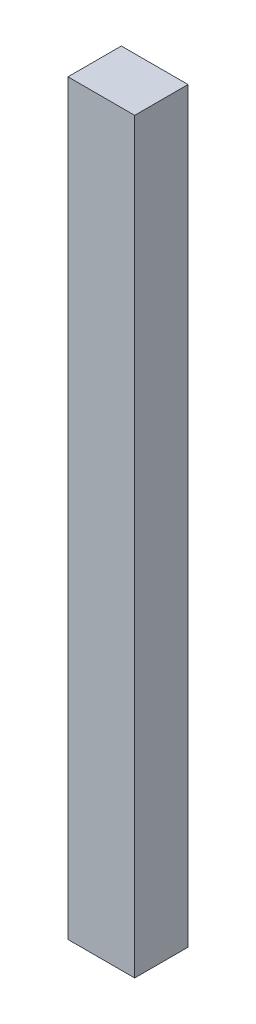
ISO-10303-21;
HEADER;
FILE_DESCRIPTION(('STEP AP214'),'2;1');
FILE_NAME('part.step','',(''),(''),'','','');
FILE_SCHEMA(('AUTOMOTIVE_DESIGN { 1 0 10303 214 1 1 1 1 }'));
ENDSEC;
DATA;
#1=APPLICATION_CONTEXT('core data for automotive mechanical design processes');
#2=APPLICATION_PROTOCOL_DEFINITION('international standard','automotive_design',2000,#1);
#3=PRODUCT_CONTEXT('',#1,'mechanical');
#4=PRODUCT('Part','Part','',(#3));
#5=PRODUCT_RELATED_PRODUCT_CATEGORY('part','',(#4));
#6=PRODUCT_DEFINITION_FORMATION('','',#4);
#7=PRODUCT_DEFINITION_CONTEXT('part definition',#1,'design');
#8=PRODUCT_DEFINITION('design','',#6,#7);
#9=PRODUCT_DEFINITION_SHAPE('','',#8);
#10=(LENGTH_UNIT() NAMED_UNIT(*) SI_UNIT(.MILLI.,.METRE.));
#11=(NAMED_UNIT(*) PLANE_ANGLE_UNIT() SI_UNIT($,.RADIAN.));
#12=(NAMED_UNIT(*) SI_UNIT($,.STERADIAN.) SOLID_ANGLE_UNIT());
#13=UNCERTAINTY_MEASURE_WITH_UNIT(LENGTH_MEASURE(1.E-05),#10,'distance_accuracy_value','');
#14=(GEOMETRIC_REPRESENTATION_CONTEXT(3) GLOBAL_UNCERTAINTY_ASSIGNED_CONTEXT((#13)) GLOBAL_UNIT_ASSIGNED_CONTEXT((#10,
#11,#12)) REPRESENTATION_CONTEXT('',''));
#15=CARTESIAN_POINT('',(0.,0.,0.));
#16=DIRECTION('',(0.,0.,1.));
#17=DIRECTION('',(1.,0.,0.));
#18=AXIS2_PLACEMENT_3D('',#15,#16,#17);
#19=CARTESIAN_POINT('',(25.,280.,40.));
#20=DIRECTION('',(0.,0.,-1.));
#21=DIRECTION('',(-1.,0.,0.));
#22=AXIS2_PLACEMENT_3D('',#19,#20,#21);
#23=PLANE('',#22);
#24=DIRECTION('',(1.,0.,0.));
#25=VECTOR('',#24,1.);
#26=CARTESIAN_POINT('',(25.,0.,40.));
#27=LINE('',#26,#25);
#28=CARTESIAN_POINT('',(0.,0.,40.));
#29=VERTEX_POINT('',#28);
#30=CARTESIAN_POINT('',(25.,0.,40.));
#31=VERTEX_POINT('',#30);
#32=EDGE_CURVE('E102',#29,#31,#27,.T.);
#33=ORIENTED_EDGE('',*,*,#32,.T.);
#34=DIRECTION('',(0.,-1.,0.));
#35=VECTOR('',#34,1.);
#36=CARTESIAN_POINT('',(25.,280.,40.));
#37=LINE('',#36,#35);
#38=CARTESIAN_POINT('',(25.,280.,40.));
#39=VERTEX_POINT('',#38);
#40=EDGE_CURVE('E11',#39,#31,#37,.T.);
#41=ORIENTED_EDGE('',*,*,#40,.F.);
#42=DIRECTION('',(1.,0.,0.));
#43=VECTOR('',#42,1.);
#44=CARTESIAN_POINT('',(25.,280.,40.));
#45=LINE('',#44,#43);
#46=CARTESIAN_POINT('',(0.,280.,40.));
#47=VERTEX_POINT('',#46);
#48=EDGE_CURVE('E90',#47,#39,#45,.T.);
#49=ORIENTED_EDGE('',*,*,#48,.F.);
#50=DIRECTION('',(0.,-1.,0.));
#51=VECTOR('',#50,1.);
#52=CARTESIAN_POINT('',(0.,280.,40.));
#53=LINE('',#52,#51);
#54=EDGE_CURVE('E98',#47,#29,#53,.T.);
#55=ORIENTED_EDGE('',*,*,#54,.T.);
#56=EDGE_LOOP('',(#33,#41,#49,#55));
#57=FACE_BOUND('',#56,.T.);
#58=ADVANCED_FACE('F39',(#57),#23,.F.);
#59=CARTESIAN_POINT('',(25.,280.,20.));
#60=DIRECTION('',(-1.,0.,0.));
#61=DIRECTION('',(0.,0.,1.));
#62=AXIS2_PLACEMENT_3D('',#59,#60,#61);
#63=PLANE('',#62);
#64=DIRECTION('',(0.,0.,-1.));
#65=VECTOR('',#64,1.);
#66=CARTESIAN_POINT('',(25.,0.,20.));
#67=LINE('',#66,#65);
#68=CARTESIAN_POINT('',(25.,0.,20.));
#69=VERTEX_POINT('',#68);
#70=EDGE_CURVE('E94',#31,#69,#67,.T.);
#71=ORIENTED_EDGE('',*,*,#70,.T.);
#72=DIRECTION('',(0.,-1.,0.));
#73=VECTOR('',#72,1.);
#74=CARTESIAN_POINT('',(25.,280.,20.));
#75=LINE('',#74,#73);
#76=CARTESIAN_POINT('',(25.,280.,20.));
#77=VERTEX_POINT('',#76);
#78=EDGE_CURVE('E47',#77,#69,#75,.T.);
#79=ORIENTED_EDGE('',*,*,#78,.F.);
#80=DIRECTION('',(0.,0.,-1.));
#81=VECTOR('',#80,1.);
#82=CARTESIAN_POINT('',(25.,280.,20.));
#83=LINE('',#82,#81);
#84=EDGE_CURVE('E85',#39,#77,#83,.T.);
#85=ORIENTED_EDGE('',*,*,#84,.F.);
#86=ORIENTED_EDGE('',*,*,#40,.T.);
#87=EDGE_LOOP('',(#71,#79,#85,#86));
#88=FACE_BOUND('',#87,.T.);
#89=ADVANCED_FACE('F93',(#88),#63,.F.);
#90=CARTESIAN_POINT('',(0.,280.,20.));
#91=DIRECTION('',(0.,0.,1.));
#92=DIRECTION('',(1.,0.,0.));
#93=AXIS2_PLACEMENT_3D('',#90,#91,#92);
#94=PLANE('',#93);
#95=DIRECTION('',(-1.,0.,0.));
#96=VECTOR('',#95,1.);
#97=CARTESIAN_POINT('',(0.,0.,20.));
#98=LINE('',#97,#96);
#99=CARTESIAN_POINT('',(0.,0.,20.));
#100=VERTEX_POINT('',#99);
#101=EDGE_CURVE('E72',#69,#100,#98,.T.);
#102=ORIENTED_EDGE('',*,*,#101,.T.);
#103=DIRECTION('',(0.,-1.,0.));
#104=VECTOR('',#103,1.);
#105=CARTESIAN_POINT('',(0.,280.,20.));
#106=LINE('',#105,#104);
#107=CARTESIAN_POINT('',(0.,280.,20.));
#108=VERTEX_POINT('',#107);
#109=EDGE_CURVE('E95',#108,#100,#106,.T.);
#110=ORIENTED_EDGE('',*,*,#109,.F.);
#111=DIRECTION('',(-1.,0.,0.));
#112=VECTOR('',#111,1.);
#113=CARTESIAN_POINT('',(0.,280.,20.));
#114=LINE('',#113,#112);
#115=EDGE_CURVE('E88',#77,#108,#114,.T.);
#116=ORIENTED_EDGE('',*,*,#115,.F.);
#117=ORIENTED_EDGE('',*,*,#78,.T.);
#118=EDGE_LOOP('',(#102,#110,#116,#117));
#119=FACE_BOUND('',#118,.T.);
#120=ADVANCED_FACE('F96',(#119),#94,.F.);
#121=CARTESIAN_POINT('',(0.,280.,40.));
#122=DIRECTION('',(1.,0.,0.));
#123=DIRECTION('',(0.,0.,-1.));
#124=AXIS2_PLACEMENT_3D('',#121,#122,#123);
#125=PLANE('',#124);
#126=DIRECTION('',(0.,0.,1.));
#127=VECTOR('',#126,1.);
#128=CARTESIAN_POINT('',(0.,0.,40.));
#129=LINE('',#128,#127);
#130=EDGE_CURVE('E78',#100,#29,#129,.T.);
#131=ORIENTED_EDGE('',*,*,#130,.T.);
#132=ORIENTED_EDGE('',*,*,#54,.F.);
#133=DIRECTION('',(0.,0.,1.));
#134=VECTOR('',#133,1.);
#135=CARTESIAN_POINT('',(0.,280.,40.));
#136=LINE('',#135,#134);
#137=EDGE_CURVE('E55',#108,#47,#136,.T.);
#138=ORIENTED_EDGE('',*,*,#137,.F.);
#139=ORIENTED_EDGE('',*,*,#109,.T.);
#140=EDGE_LOOP('',(#131,#132,#138,#139));
#141=FACE_BOUND('',#140,.T.);
#142=ADVANCED_FACE('F109',(#141),#125,.F.);
#143=CARTESIAN_POINT('',(0.,280.,0.));
#144=DIRECTION('',(0.,-1.,0.));
#145=DIRECTION('',(0.,0.,-1.));
#146=AXIS2_PLACEMENT_3D('',#143,#144,#145);
#147=PLANE('',#146);
#148=ORIENTED_EDGE('',*,*,#48,.T.);
#149=ORIENTED_EDGE('',*,*,#84,.T.);
#150=ORIENTED_EDGE('',*,*,#115,.T.);
#151=ORIENTED_EDGE('',*,*,#137,.T.);
#152=EDGE_LOOP('',(#148,#149,#150,#151));
#153=FACE_BOUND('',#152,.T.);
#154=ADVANCED_FACE('F86',(#153),#147,.F.);
#155=CARTESIAN_POINT('',(0.,0.,0.));
#156=DIRECTION('',(0.,-1.,0.));
#157=DIRECTION('',(0.,0.,-1.));
#158=AXIS2_PLACEMENT_3D('',#155,#156,#157);
#159=PLANE('',#158);
#160=ORIENTED_EDGE('',*,*,#32,.F.);
#161=ORIENTED_EDGE('',*,*,#130,.F.);
#162=ORIENTED_EDGE('',*,*,#101,.F.);
#163=ORIENTED_EDGE('',*,*,#70,.F.);
#164=EDGE_LOOP('',(#160,#161,#162,#163));
#165=FACE_BOUND('',#164,.T.);
#166=ADVANCED_FACE('F112',(#165),#159,.T.);
#167=CLOSED_SHELL('',(#58,#89,#120,#142,#154,#166));
#168=MANIFOLD_SOLID_BREP('B2',#167);
#169=ADVANCED_BREP_SHAPE_REPRESENTATION('',(#18,#168),#14);
#170=SHAPE_DEFINITION_REPRESENTATION(#9,#169);
ENDSEC;
END-ISO-10303-21;
